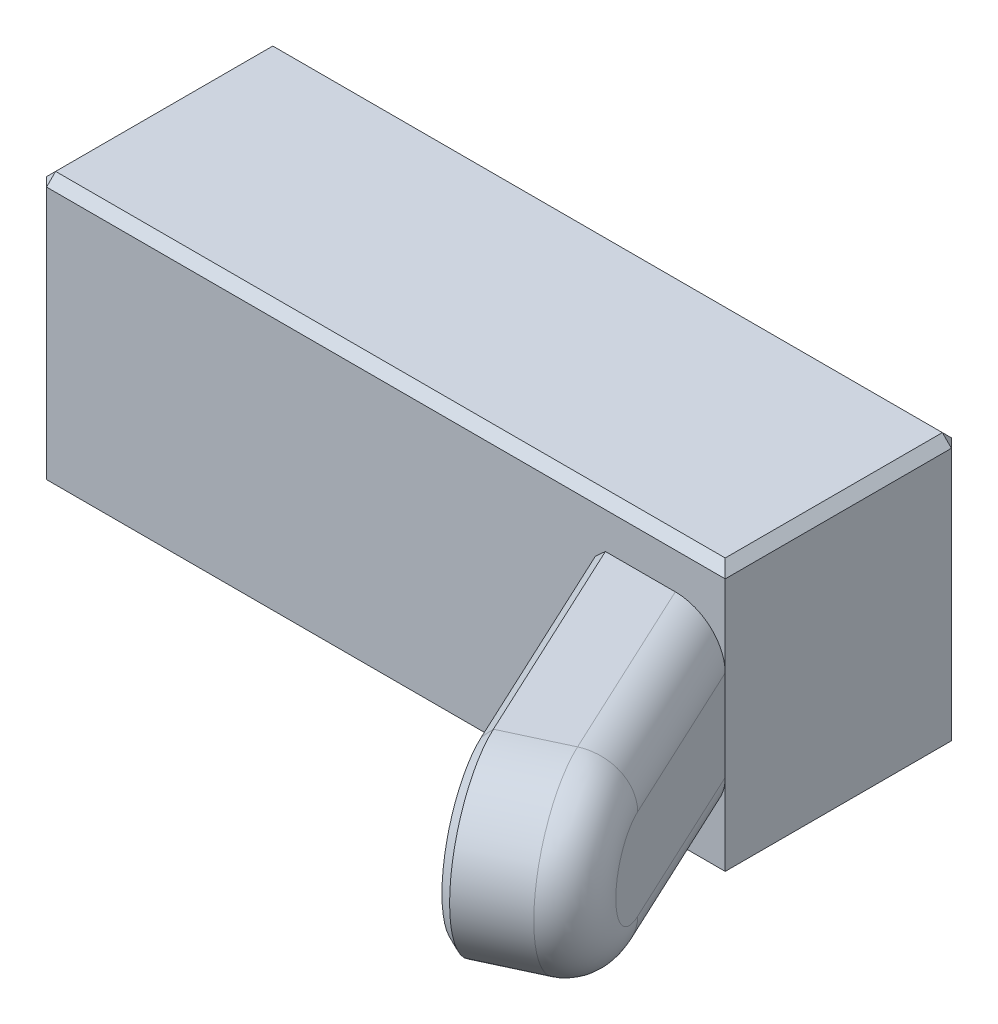
ISO-10303-21;
HEADER;
FILE_DESCRIPTION(('STEP AP214'),'2;1');
FILE_NAME('part.step','',(''),(''),'','','');
FILE_SCHEMA(('AUTOMOTIVE_DESIGN { 1 0 10303 214 1 1 1 1 }'));
ENDSEC;
DATA;
#1=APPLICATION_CONTEXT('core data for automotive mechanical design processes');
#2=APPLICATION_PROTOCOL_DEFINITION('international standard','automotive_design',2000,#1);
#3=PRODUCT_CONTEXT('',#1,'mechanical');
#4=PRODUCT('Part','Part','',(#3));
#5=PRODUCT_RELATED_PRODUCT_CATEGORY('part','',(#4));
#6=PRODUCT_DEFINITION_FORMATION('','',#4);
#7=PRODUCT_DEFINITION_CONTEXT('part definition',#1,'design');
#8=PRODUCT_DEFINITION('design','',#6,#7);
#9=PRODUCT_DEFINITION_SHAPE('','',#8);
#10=(LENGTH_UNIT() NAMED_UNIT(*) SI_UNIT(.MILLI.,.METRE.));
#11=(NAMED_UNIT(*) PLANE_ANGLE_UNIT() SI_UNIT($,.RADIAN.));
#12=(NAMED_UNIT(*) SI_UNIT($,.STERADIAN.) SOLID_ANGLE_UNIT());
#13=UNCERTAINTY_MEASURE_WITH_UNIT(LENGTH_MEASURE(1.E-05),#10,'distance_accuracy_value','');
#14=(GEOMETRIC_REPRESENTATION_CONTEXT(3) GLOBAL_UNCERTAINTY_ASSIGNED_CONTEXT((#13)) GLOBAL_UNIT_ASSIGNED_CONTEXT((#10,
#11,#12)) REPRESENTATION_CONTEXT('',''));
#15=CARTESIAN_POINT('',(0.,0.,0.));
#16=DIRECTION('',(0.,0.,1.));
#17=DIRECTION('',(1.,0.,0.));
#18=AXIS2_PLACEMENT_3D('',#15,#16,#17);
#19=CARTESIAN_POINT('',(-38.,-15.,13.));
#20=DIRECTION('',(-1.,0.,0.));
#21=DIRECTION('',(0.,0.,1.));
#22=AXIS2_PLACEMENT_3D('',#19,#20,#21);
#23=PLANE('',#22);
#24=DIRECTION('',(0.,-1.,0.));
#25=VECTOR('',#24,1.);
#26=CARTESIAN_POINT('',(-38.,-15.,-12.));
#27=LINE('',#26,#25);
#28=CARTESIAN_POINT('',(-38.,14.,-12.));
#29=VERTEX_POINT('',#28);
#30=CARTESIAN_POINT('',(-38.,-14.,-12.));
#31=VERTEX_POINT('',#30);
#32=EDGE_CURVE('E248',#29,#31,#27,.T.);
#33=ORIENTED_EDGE('',*,*,#32,.T.);
#34=DIRECTION('',(0.,0.,1.));
#35=VECTOR('',#34,1.);
#36=CARTESIAN_POINT('',(-38.,-14.,13.));
#37=LINE('',#36,#35);
#38=CARTESIAN_POINT('',(-38.,-14.,12.));
#39=VERTEX_POINT('',#38);
#40=EDGE_CURVE('E251',#31,#39,#37,.T.);
#41=ORIENTED_EDGE('',*,*,#40,.T.);
#42=DIRECTION('',(0.,1.,0.));
#43=VECTOR('',#42,1.);
#44=CARTESIAN_POINT('',(-38.,-15.,12.));
#45=LINE('',#44,#43);
#46=CARTESIAN_POINT('',(-38.,14.,12.));
#47=VERTEX_POINT('',#46);
#48=EDGE_CURVE('E246',#39,#47,#45,.T.);
#49=ORIENTED_EDGE('',*,*,#48,.T.);
#50=DIRECTION('',(0.,0.,-1.));
#51=VECTOR('',#50,1.);
#52=CARTESIAN_POINT('',(-38.,14.,13.));
#53=LINE('',#52,#51);
#54=EDGE_CURVE('E244',#47,#29,#53,.T.);
#55=ORIENTED_EDGE('',*,*,#54,.T.);
#56=EDGE_LOOP('',(#33,#41,#49,#55));
#57=FACE_BOUND('',#56,.T.);
#58=ADVANCED_FACE('F35',(#57),#23,.T.);
#59=CARTESIAN_POINT('',(38.,-15.,-13.));
#60=DIRECTION('',(0.,0.,-1.));
#61=DIRECTION('',(-1.,0.,0.));
#62=AXIS2_PLACEMENT_3D('',#59,#60,#61);
#63=PLANE('',#62);
#64=DIRECTION('',(-1.,0.,0.));
#65=VECTOR('',#64,1.);
#66=CARTESIAN_POINT('',(-38.,-14.,-13.));
#67=LINE('',#66,#65);
#68=CARTESIAN_POINT('',(37.,-14.,-13.));
#69=VERTEX_POINT('',#68);
#70=CARTESIAN_POINT('',(-37.,-14.,-13.));
#71=VERTEX_POINT('',#70);
#72=EDGE_CURVE('E239',#69,#71,#67,.T.);
#73=ORIENTED_EDGE('',*,*,#72,.T.);
#74=DIRECTION('',(0.,1.,0.));
#75=VECTOR('',#74,1.);
#76=CARTESIAN_POINT('',(-37.,-15.,-13.));
#77=LINE('',#76,#75);
#78=CARTESIAN_POINT('',(-37.,14.,-13.));
#79=VERTEX_POINT('',#78);
#80=EDGE_CURVE('E241',#71,#79,#77,.T.);
#81=ORIENTED_EDGE('',*,*,#80,.T.);
#82=DIRECTION('',(1.,0.,0.));
#83=VECTOR('',#82,1.);
#84=CARTESIAN_POINT('',(38.,14.,-13.));
#85=LINE('',#84,#83);
#86=CARTESIAN_POINT('',(37.,14.,-13.));
#87=VERTEX_POINT('',#86);
#88=EDGE_CURVE('E237',#79,#87,#85,.T.);
#89=ORIENTED_EDGE('',*,*,#88,.T.);
#90=DIRECTION('',(0.,-1.,0.));
#91=VECTOR('',#90,1.);
#92=CARTESIAN_POINT('',(37.,-15.,-13.));
#93=LINE('',#92,#91);
#94=EDGE_CURVE('E235',#87,#69,#93,.T.);
#95=ORIENTED_EDGE('',*,*,#94,.T.);
#96=EDGE_LOOP('',(#73,#81,#89,#95));
#97=FACE_BOUND('',#96,.T.);
#98=ADVANCED_FACE('F372',(#97),#63,.T.);
#99=CARTESIAN_POINT('',(38.,-15.,13.));
#100=DIRECTION('',(1.,0.,0.));
#101=DIRECTION('',(0.,0.,-1.));
#102=AXIS2_PLACEMENT_3D('',#99,#100,#101);
#103=PLANE('',#102);
#104=DIRECTION('',(0.,1.,0.));
#105=VECTOR('',#104,1.);
#106=CARTESIAN_POINT('',(38.,-15.,13.));
#107=LINE('',#106,#105);
#108=CARTESIAN_POINT('',(38.,-14.,13.));
#109=VERTEX_POINT('',#108);
#110=CARTESIAN_POINT('',(38.,-5.,13.));
#111=VERTEX_POINT('',#110);
#112=EDGE_CURVE('E188',#109,#111,#107,.T.);
#113=ORIENTED_EDGE('',*,*,#112,.F.);
#114=DIRECTION('',(0.,0.,-1.));
#115=VECTOR('',#114,1.);
#116=CARTESIAN_POINT('',(38.,-14.,-13.));
#117=LINE('',#116,#115);
#118=CARTESIAN_POINT('',(38.,-14.,-12.));
#119=VERTEX_POINT('',#118);
#120=EDGE_CURVE('E272',#109,#119,#117,.T.);
#121=ORIENTED_EDGE('',*,*,#120,.T.);
#122=DIRECTION('',(0.,1.,0.));
#123=VECTOR('',#122,1.);
#124=CARTESIAN_POINT('',(38.,-15.,-12.));
#125=LINE('',#124,#123);
#126=CARTESIAN_POINT('',(38.,14.,-12.));
#127=VERTEX_POINT('',#126);
#128=EDGE_CURVE('E268',#119,#127,#125,.T.);
#129=ORIENTED_EDGE('',*,*,#128,.T.);
#130=DIRECTION('',(0.,0.,1.));
#131=VECTOR('',#130,1.);
#132=CARTESIAN_POINT('',(38.,14.,13.));
#133=LINE('',#132,#131);
#134=CARTESIAN_POINT('',(38.,14.,13.));
#135=VERTEX_POINT('',#134);
#136=EDGE_CURVE('E270',#127,#135,#133,.T.);
#137=ORIENTED_EDGE('',*,*,#136,.T.);
#138=CARTESIAN_POINT('',(38.,5.,13.));
#139=VERTEX_POINT('',#138);
#140=EDGE_CURVE('E204',#139,#135,#107,.T.);
#141=ORIENTED_EDGE('',*,*,#140,.F.);
#142=DIRECTION('',(0.,-1.,0.));
#143=VECTOR('',#142,1.);
#144=CARTESIAN_POINT('',(38.,10.,13.));
#145=LINE('',#144,#143);
#146=EDGE_CURVE('E648',#139,#111,#145,.T.);
#147=ORIENTED_EDGE('',*,*,#146,.T.);
#148=EDGE_LOOP('',(#113,#121,#129,#137,#141,#147));
#149=FACE_BOUND('',#148,.T.);
#150=ADVANCED_FACE('F404',(#149),#103,.T.);
#151=CARTESIAN_POINT('',(38.,-15.,13.));
#152=DIRECTION('',(0.,0.,1.));
#153=DIRECTION('',(1.,0.,0.));
#154=AXIS2_PLACEMENT_3D('',#151,#152,#153);
#155=PLANE('',#154);
#156=DIRECTION('',(0.,-1.,0.));
#157=VECTOR('',#156,1.);
#158=CARTESIAN_POINT('',(-37.,-15.,13.));
#159=LINE('',#158,#157);
#160=CARTESIAN_POINT('',(-37.,14.,13.));
#161=VERTEX_POINT('',#160);
#162=CARTESIAN_POINT('',(-37.,-14.,13.));
#163=VERTEX_POINT('',#162);
#164=EDGE_CURVE('E255',#161,#163,#159,.T.);
#165=ORIENTED_EDGE('',*,*,#164,.T.);
#166=DIRECTION('',(1.,0.,0.));
#167=VECTOR('',#166,1.);
#168=CARTESIAN_POINT('',(38.,-14.,13.));
#169=LINE('',#168,#167);
#170=EDGE_CURVE('E257',#163,#109,#169,.T.);
#171=ORIENTED_EDGE('',*,*,#170,.T.);
#172=ORIENTED_EDGE('',*,*,#112,.T.);
#173=CARTESIAN_POINT('',(32.4831104051875,-5.,13.));
#174=DIRECTION('',(0.,0.,1.));
#175=DIRECTION('',(1.,0.,0.));
#176=AXIS2_PLACEMENT_3D('',#173,#174,#175);
#177=ELLIPSE('',#176,5.51688959481248,5.);
#178=CARTESIAN_POINT('',(32.4831104051875,-10.,13.));
#179=VERTEX_POINT('',#178);
#180=EDGE_CURVE('E184',#111,#179,#177,.F.);
#181=ORIENTED_EDGE('',*,*,#180,.T.);
#182=DIRECTION('',(1.,0.,0.));
#183=VECTOR('',#182,1.);
#184=CARTESIAN_POINT('',(14.4665061710177,-10.,13.));
#185=LINE('',#184,#183);
#186=CARTESIAN_POINT('',(24.75946497245,-10.,13.));
#187=VERTEX_POINT('',#186);
#188=EDGE_CURVE('E170',#187,#179,#185,.T.);
#189=ORIENTED_EDGE('',*,*,#188,.F.);
#190=DIRECTION('',(0.740965645273289,-0.671542934237819,0.));
#191=VECTOR('',#190,1.);
#192=CARTESIAN_POINT('',(12.142057490973,1.43525465267711,13.));
#193=LINE('',#192,#191);
#194=CARTESIAN_POINT('',(23.6560870534876,-9.00000000000001,13.));
#195=VERTEX_POINT('',#194);
#196=EDGE_CURVE('E281',#187,#195,#193,.F.);
#197=ORIENTED_EDGE('',*,*,#196,.T.);
#198=DIRECTION('',(0.,-1.,0.));
#199=VECTOR('',#198,1.);
#200=CARTESIAN_POINT('',(23.6560870534876,-10.,13.));
#201=LINE('',#200,#199);
#202=CARTESIAN_POINT('',(23.6560870534876,9.00000000000002,13.));
#203=VERTEX_POINT('',#202);
#204=EDGE_CURVE('E180',#203,#195,#201,.T.);
#205=ORIENTED_EDGE('',*,*,#204,.F.);
#206=DIRECTION('',(-0.740965645273287,-0.671542934237821,0.));
#207=VECTOR('',#206,1.);
#208=CARTESIAN_POINT('',(13.1372379781656,-0.533314827627652,13.));
#209=LINE('',#208,#207);
#210=CARTESIAN_POINT('',(24.75946497245,10.,13.));
#211=VERTEX_POINT('',#210);
#212=EDGE_CURVE('E44',#203,#211,#209,.F.);
#213=ORIENTED_EDGE('',*,*,#212,.T.);
#214=DIRECTION('',(-1.,0.,0.));
#215=VECTOR('',#214,1.);
#216=CARTESIAN_POINT('',(2.68450493954131,10.,13.));
#217=LINE('',#216,#215);
#218=CARTESIAN_POINT('',(32.4831104051875,10.,13.));
#219=VERTEX_POINT('',#218);
#220=EDGE_CURVE('E181',#219,#211,#217,.T.);
#221=ORIENTED_EDGE('',*,*,#220,.F.);
#222=CARTESIAN_POINT('',(32.4831104051875,5.,13.));
#223=DIRECTION('',(0.,0.,1.));
#224=DIRECTION('',(-1.,0.,0.));
#225=AXIS2_PLACEMENT_3D('',#222,#223,#224);
#226=ELLIPSE('',#225,5.51688959481248,5.);
#227=EDGE_CURVE('E192',#219,#139,#226,.F.);
#228=ORIENTED_EDGE('',*,*,#227,.T.);
#229=ORIENTED_EDGE('',*,*,#140,.T.);
#230=DIRECTION('',(-1.,0.,0.));
#231=VECTOR('',#230,1.);
#232=CARTESIAN_POINT('',(38.,14.,13.));
#233=LINE('',#232,#231);
#234=EDGE_CURVE('E253',#135,#161,#233,.T.);
#235=ORIENTED_EDGE('',*,*,#234,.T.);
#236=EDGE_LOOP('',(#165,#171,#172,#181,#189,#197,#205,#213,#221,#228,#229,#235));
#237=FACE_BOUND('',#236,.T.);
#238=ADVANCED_FACE('F186',(#237),#155,.T.);
#239=CARTESIAN_POINT('',(0.,-15.,0.));
#240=DIRECTION('',(0.,1.,0.));
#241=DIRECTION('',(0.,0.,1.));
#242=AXIS2_PLACEMENT_3D('',#239,#240,#241);
#243=PLANE('',#242);
#244=CARTESIAN_POINT('',(-28.,-15.,0.));
#245=DIRECTION('',(0.,1.,0.));
#246=DIRECTION('',(0.,0.,1.));
#247=AXIS2_PLACEMENT_3D('',#244,#245,#246);
#248=CIRCLE('',#247,5.);
#249=CARTESIAN_POINT('',(-28.,-15.,5.));
#250=VERTEX_POINT('',#249);
#251=EDGE_CURVE('E11',#250,#250,#248,.F.);
#252=ORIENTED_EDGE('',*,*,#251,.F.);
#253=EDGE_LOOP('',(#252));
#254=FACE_BOUND('',#253,.T.);
#255=DIRECTION('',(0.,0.,1.));
#256=VECTOR('',#255,1.);
#257=CARTESIAN_POINT('',(37.,-15.,13.));
#258=LINE('',#257,#256);
#259=CARTESIAN_POINT('',(37.,-15.,-12.));
#260=VERTEX_POINT('',#259);
#261=CARTESIAN_POINT('',(37.,-15.,12.));
#262=VERTEX_POINT('',#261);
#263=EDGE_CURVE('E263',#260,#262,#258,.T.);
#264=ORIENTED_EDGE('',*,*,#263,.T.);
#265=DIRECTION('',(-1.,0.,0.));
#266=VECTOR('',#265,1.);
#267=CARTESIAN_POINT('',(-38.,-15.,12.));
#268=LINE('',#267,#266);
#269=CARTESIAN_POINT('',(-37.,-15.,12.));
#270=VERTEX_POINT('',#269);
#271=EDGE_CURVE('E265',#262,#270,#268,.T.);
#272=ORIENTED_EDGE('',*,*,#271,.T.);
#273=DIRECTION('',(0.,0.,-1.));
#274=VECTOR('',#273,1.);
#275=CARTESIAN_POINT('',(-37.,-15.,-13.));
#276=LINE('',#275,#274);
#277=CARTESIAN_POINT('',(-37.,-15.,-12.));
#278=VERTEX_POINT('',#277);
#279=EDGE_CURVE('E261',#270,#278,#276,.T.);
#280=ORIENTED_EDGE('',*,*,#279,.T.);
#281=DIRECTION('',(1.,0.,0.));
#282=VECTOR('',#281,1.);
#283=CARTESIAN_POINT('',(38.,-15.,-12.));
#284=LINE('',#283,#282);
#285=EDGE_CURVE('E259',#278,#260,#284,.T.);
#286=ORIENTED_EDGE('',*,*,#285,.T.);
#287=EDGE_LOOP('',(#264,#272,#280,#286));
#288=FACE_BOUND('',#287,.T.);
#289=ADVANCED_FACE('F352',(#254,#288),#243,.F.);
#290=CARTESIAN_POINT('',(0.,15.,0.));
#291=DIRECTION('',(0.,1.,0.));
#292=DIRECTION('',(0.,0.,1.));
#293=AXIS2_PLACEMENT_3D('',#290,#291,#292);
#294=PLANE('',#293);
#295=DIRECTION('',(0.,0.,-1.));
#296=VECTOR('',#295,1.);
#297=CARTESIAN_POINT('',(37.,15.,0.));
#298=LINE('',#297,#296);
#299=CARTESIAN_POINT('',(37.,15.,12.));
#300=VERTEX_POINT('',#299);
#301=CARTESIAN_POINT('',(37.,15.,-12.));
#302=VERTEX_POINT('',#301);
#303=EDGE_CURVE('E274',#300,#302,#298,.T.);
#304=ORIENTED_EDGE('',*,*,#303,.T.);
#305=DIRECTION('',(-1.,0.,0.));
#306=VECTOR('',#305,1.);
#307=CARTESIAN_POINT('',(0.,15.,-12.));
#308=LINE('',#307,#306);
#309=CARTESIAN_POINT('',(-37.,15.,-12.));
#310=VERTEX_POINT('',#309);
#311=EDGE_CURVE('E279',#302,#310,#308,.T.);
#312=ORIENTED_EDGE('',*,*,#311,.T.);
#313=DIRECTION('',(0.,0.,1.));
#314=VECTOR('',#313,1.);
#315=CARTESIAN_POINT('',(-37.,15.,0.));
#316=LINE('',#315,#314);
#317=CARTESIAN_POINT('',(-37.,15.,12.));
#318=VERTEX_POINT('',#317);
#319=EDGE_CURVE('E59',#310,#318,#316,.T.);
#320=ORIENTED_EDGE('',*,*,#319,.T.);
#321=DIRECTION('',(1.,0.,0.));
#322=VECTOR('',#321,1.);
#323=CARTESIAN_POINT('',(0.,15.,12.));
#324=LINE('',#323,#322);
#325=EDGE_CURVE('E276',#318,#300,#324,.T.);
#326=ORIENTED_EDGE('',*,*,#325,.T.);
#327=EDGE_LOOP('',(#304,#312,#320,#326));
#328=FACE_BOUND('',#327,.T.);
#329=ADVANCED_FACE('F573',(#328),#294,.T.);
#330=CARTESIAN_POINT('',(14.4665061710177,-10.,-37.4677403800205));
#331=DIRECTION('',(0.,1.,0.));
#332=DIRECTION('',(0.,0.,1.));
#333=AXIS2_PLACEMENT_3D('',#330,#331,#332);
#334=PLANE('',#333);
#335=DIRECTION('',(0.906307787036647,0.,-0.422618261740706));
#336=VECTOR('',#335,1.);
#337=CARTESIAN_POINT('',(34.6703640033377,-10.,36.6201931433621));
#338=LINE('',#337,#336);
#339=CARTESIAN_POINT('',(35.5766717903744,-10.,36.1975748816214));
#340=VERTEX_POINT('',#339);
#341=CARTESIAN_POINT('',(41.9208262996309,-10.,33.2392470494365));
#342=VERTEX_POINT('',#341);
#343=EDGE_CURVE('E646',#340,#342,#338,.T.);
#344=ORIENTED_EDGE('',*,*,#343,.F.);
#345=DIRECTION('',(-0.422618261740707,0.,-0.906307787036647));
#346=VECTOR('',#345,1.);
#347=CARTESIAN_POINT('',(3.59081272657794,-10.,-32.396321239132));
#348=LINE('',#347,#346);
#349=EDGE_CURVE('E177',#340,#187,#348,.T.);
#350=ORIENTED_EDGE('',*,*,#349,.T.);
#351=ORIENTED_EDGE('',*,*,#188,.T.);
#352=DIRECTION('',(0.422618261740706,0.,0.906307787036647));
#353=VECTOR('',#352,1.);
#354=CARTESIAN_POINT('',(9.93496723583448,-10.,-35.354649071317));
#355=LINE('',#354,#353);
#356=EDGE_CURVE('E175',#179,#342,#355,.T.);
#357=ORIENTED_EDGE('',*,*,#356,.T.);
#358=EDGE_LOOP('',(#344,#350,#351,#357));
#359=FACE_BOUND('',#358,.T.);
#360=ADVANCED_FACE('F173',(#359),#334,.F.);
#361=CARTESIAN_POINT('',(2.6845049395413,-10.,-31.9737029773913));
#362=DIRECTION('',(0.906307787036647,0.,-0.422618261740706));
#363=DIRECTION('',(-0.422618261740706,0.,-0.906307787036647));
#364=AXIS2_PLACEMENT_3D('',#361,#362,#363);
#365=PLANE('',#364);
#366=ORIENTED_EDGE('',*,*,#204,.T.);
#367=DIRECTION('',(0.422618261740706,0.,0.906307787036647));
#368=VECTOR('',#367,1.);
#369=CARTESIAN_POINT('',(2.6845049395413,-9.00000000000001,-31.9737029773913));
#370=LINE('',#369,#368);
#371=CARTESIAN_POINT('',(34.6703640033377,-9.00000000000001,36.6201931433621));
#372=VERTEX_POINT('',#371);
#373=EDGE_CURVE('E227',#195,#372,#370,.T.);
#374=ORIENTED_EDGE('',*,*,#373,.T.);
#375=CARTESIAN_POINT('',(34.6703640033377,0.,36.6201931433621));
#376=DIRECTION('',(0.906307787036647,0.,-0.422618261740706));
#377=DIRECTION('',(-0.422618261740706,0.,-0.906307787036647));
#378=AXIS2_PLACEMENT_3D('',#375,#376,#377);
#379=CIRCLE('',#378,9.00000000000001);
#380=CARTESIAN_POINT('',(34.6703640033377,9.00000000000002,36.6201931433621));
#381=VERTEX_POINT('',#380);
#382=EDGE_CURVE('E225',#372,#381,#379,.F.);
#383=ORIENTED_EDGE('',*,*,#382,.T.);
#384=DIRECTION('',(-0.422618261740706,0.,-0.906307787036647));
#385=VECTOR('',#384,1.);
#386=CARTESIAN_POINT('',(2.6845049395413,9.00000000000002,-31.9737029773913));
#387=LINE('',#386,#385);
#388=EDGE_CURVE('E217',#381,#203,#387,.T.);
#389=ORIENTED_EDGE('',*,*,#388,.T.);
#390=EDGE_LOOP('',(#366,#374,#383,#389));
#391=FACE_BOUND('',#390,.T.);
#392=ADVANCED_FACE('F570',(#391),#365,.F.);
#393=CARTESIAN_POINT('',(2.6845049395413,10.,-31.9737029773913));
#394=DIRECTION('',(0.,-1.,0.));
#395=DIRECTION('',(0.,0.,-1.));
#396=AXIS2_PLACEMENT_3D('',#393,#394,#395);
#397=PLANE('',#396);
#398=ORIENTED_EDGE('',*,*,#220,.T.);
#399=DIRECTION('',(0.422618261740707,0.,0.906307787036647));
#400=VECTOR('',#399,1.);
#401=CARTESIAN_POINT('',(3.59081272657793,10.,-32.396321239132));
#402=LINE('',#401,#400);
#403=CARTESIAN_POINT('',(35.5766717903744,10.,36.1975748816214));
#404=VERTEX_POINT('',#403);
#405=EDGE_CURVE('E233',#211,#404,#402,.T.);
#406=ORIENTED_EDGE('',*,*,#405,.T.);
#407=DIRECTION('',(0.906307787036647,0.,-0.422618261740706));
#408=VECTOR('',#407,1.);
#409=CARTESIAN_POINT('',(34.6703640033377,10.,36.6201931433621));
#410=LINE('',#409,#408);
#411=CARTESIAN_POINT('',(41.9208262996309,10.,33.2392470494365));
#412=VERTEX_POINT('',#411);
#413=EDGE_CURVE('E223',#404,#412,#410,.T.);
#414=ORIENTED_EDGE('',*,*,#413,.T.);
#415=DIRECTION('',(-0.422618261740706,0.,-0.906307787036647));
#416=VECTOR('',#415,1.);
#417=CARTESIAN_POINT('',(9.93496723583449,10.,-35.354649071317));
#418=LINE('',#417,#416);
#419=EDGE_CURVE('E211',#412,#219,#418,.T.);
#420=ORIENTED_EDGE('',*,*,#419,.T.);
#421=EDGE_LOOP('',(#398,#406,#414,#420));
#422=FACE_BOUND('',#421,.T.);
#423=ADVANCED_FACE('F562',(#422),#397,.F.);
#424=CARTESIAN_POINT('',(34.6703640033377,0.,36.6201931433621));
#425=DIRECTION('',(0.906307787036647,0.,-0.422618261740706));
#426=DIRECTION('',(-0.422618261740706,0.,-0.906307787036647));
#427=AXIS2_PLACEMENT_3D('',#424,#425,#426);
#428=CYLINDRICAL_SURFACE('',#427,10.);
#429=ORIENTED_EDGE('',*,*,#413,.F.);
#430=CARTESIAN_POINT('',(35.5766717903744,0.,36.1975748816214));
#431=DIRECTION('',(0.906307787036646,0.,-0.422618261740708));
#432=DIRECTION('',(-0.422618261740708,0.,-0.906307787036646));
#433=AXIS2_PLACEMENT_3D('',#430,#431,#432);
#434=CIRCLE('',#433,10.);
#435=EDGE_CURVE('E231',#404,#340,#434,.T.);
#436=ORIENTED_EDGE('',*,*,#435,.T.);
#437=ORIENTED_EDGE('',*,*,#343,.T.);
#438=CARTESIAN_POINT('',(41.9208262996309,0.,33.2392470494365));
#439=DIRECTION('',(-0.906307787036647,0.,0.422618261740706));
#440=DIRECTION('',(0.422618261740706,0.,0.906307787036647));
#441=AXIS2_PLACEMENT_3D('',#438,#439,#440);
#442=CIRCLE('',#441,10.);
#443=EDGE_CURVE('E193',#342,#412,#442,.T.);
#444=ORIENTED_EDGE('',*,*,#443,.T.);
#445=EDGE_LOOP('',(#429,#436,#437,#444));
#446=FACE_BOUND('',#445,.T.);
#447=ADVANCED_FACE('F555',(#446),#428,.T.);
#448=CARTESIAN_POINT('',(46.4523652348141,0.,31.1261557407329));
#449=DIRECTION('',(-0.906307787036647,0.,0.422618261740706));
#450=DIRECTION('',(0.422618261740706,0.,0.906307787036647));
#451=AXIS2_PLACEMENT_3D('',#448,#449,#450);
#452=PLANE('',#451);
#453=CARTESIAN_POINT('',(46.4523652348141,0.,31.1261557407329));
#454=DIRECTION('',(-0.906307787036647,0.,0.422618261740706));
#455=DIRECTION('',(0.422618261740706,0.,0.906307787036647));
#456=AXIS2_PLACEMENT_3D('',#453,#454,#455);
#457=CIRCLE('',#456,5.);
#458=CARTESIAN_POINT('',(46.4523652348141,5.,31.1261557407329));
#459=VERTEX_POINT('',#458);
#460=CARTESIAN_POINT('',(46.4523652348141,-5.,31.1261557407329));
#461=VERTEX_POINT('',#460);
#462=EDGE_CURVE('E200',#459,#461,#457,.F.);
#463=ORIENTED_EDGE('',*,*,#462,.T.);
#464=DIRECTION('',(0.422618261740706,0.,0.906307787036647));
#465=VECTOR('',#464,1.);
#466=CARTESIAN_POINT('',(46.4523652348141,-5.,31.1261557407329));
#467=LINE('',#466,#465);
#468=EDGE_CURVE('E209',#461,#111,#467,.F.);
#469=ORIENTED_EDGE('',*,*,#468,.T.);
#470=ORIENTED_EDGE('',*,*,#146,.F.);
#471=DIRECTION('',(-0.422618261740706,0.,-0.906307787036647));
#472=VECTOR('',#471,1.);
#473=CARTESIAN_POINT('',(46.4523652348141,5.,31.1261557407329));
#474=LINE('',#473,#472);
#475=EDGE_CURVE('E202',#139,#459,#474,.F.);
#476=ORIENTED_EDGE('',*,*,#475,.T.);
#477=EDGE_LOOP('',(#463,#469,#470,#476));
#478=FACE_BOUND('',#477,.T.);
#479=ADVANCED_FACE('F419',(#478),#452,.F.);
#480=CARTESIAN_POINT('',(9.93496723583449,5.,-35.354649071317));
#481=DIRECTION('',(-0.422618261740706,0.,-0.906307787036647));
#482=DIRECTION('',(-0.906307787036647,0.,0.422618261740706));
#483=AXIS2_PLACEMENT_3D('',#480,#481,#482);
#484=CYLINDRICAL_SURFACE('',#483,5.);
#485=ORIENTED_EDGE('',*,*,#227,.F.);
#486=ORIENTED_EDGE('',*,*,#419,.F.);
#487=CARTESIAN_POINT('',(41.9208262996309,5.,33.2392470494365));
#488=DIRECTION('',(0.422618261740707,0.,0.906307787036647));
#489=DIRECTION('',(0.906307787036647,0.,-0.422618261740707));
#490=AXIS2_PLACEMENT_3D('',#487,#488,#489);
#491=CIRCLE('',#490,5.);
#492=EDGE_CURVE('E219',#459,#412,#491,.T.);
#493=ORIENTED_EDGE('',*,*,#492,.F.);
#494=ORIENTED_EDGE('',*,*,#475,.F.);
#495=EDGE_LOOP('',(#485,#486,#493,#494));
#496=FACE_BOUND('',#495,.T.);
#497=ADVANCED_FACE('F415',(#496),#484,.T.);
#498=CARTESIAN_POINT('',(41.9208262996309,0.,33.2392470494365));
#499=DIRECTION('',(-0.906307787036647,0.,0.422618261740706));
#500=DIRECTION('',(0.422618261740706,0.,0.906307787036647));
#501=AXIS2_PLACEMENT_3D('',#498,#499,#500);
#502=DEGENERATE_TOROIDAL_SURFACE('',#501,5.,5.,.T.);
#503=ORIENTED_EDGE('',*,*,#492,.T.);
#504=ORIENTED_EDGE('',*,*,#443,.F.);
#505=CARTESIAN_POINT('',(41.9208262996309,-5.,33.2392470494365));
#506=DIRECTION('',(-0.422618261740707,0.,-0.906307787036646));
#507=DIRECTION('',(-0.906307787036647,0.,0.422618261740707));
#508=AXIS2_PLACEMENT_3D('',#505,#506,#507);
#509=CIRCLE('',#508,5.);
#510=EDGE_CURVE('E198',#461,#342,#509,.T.);
#511=ORIENTED_EDGE('',*,*,#510,.F.);
#512=ORIENTED_EDGE('',*,*,#462,.F.);
#513=EDGE_LOOP('',(#503,#504,#511,#512));
#514=FACE_BOUND('',#513,.T.);
#515=ADVANCED_FACE('F412',(#514),#502,.T.);
#516=CARTESIAN_POINT('',(9.93496723583449,-5.,-35.354649071317));
#517=DIRECTION('',(0.422618261740706,0.,0.906307787036647));
#518=DIRECTION('',(0.906307787036647,0.,-0.422618261740706));
#519=AXIS2_PLACEMENT_3D('',#516,#517,#518);
#520=CYLINDRICAL_SURFACE('',#519,5.);
#521=ORIENTED_EDGE('',*,*,#180,.F.);
#522=ORIENTED_EDGE('',*,*,#468,.F.);
#523=ORIENTED_EDGE('',*,*,#510,.T.);
#524=ORIENTED_EDGE('',*,*,#356,.F.);
#525=EDGE_LOOP('',(#521,#522,#523,#524));
#526=FACE_BOUND('',#525,.T.);
#527=ADVANCED_FACE('F196',(#526),#520,.T.);
#528=CARTESIAN_POINT('',(3.59081272657793,10.,-32.396321239132));
#529=DIRECTION('',(0.64085638205579,-0.707106781186543,-0.298836238730126));
#530=DIRECTION('',(0.422618261740706,0.,0.906307787036647));
#531=AXIS2_PLACEMENT_3D('',#528,#529,#530);
#532=PLANE('',#531);
#533=ORIENTED_EDGE('',*,*,#212,.F.);
#534=ORIENTED_EDGE('',*,*,#388,.F.);
#535=DIRECTION('',(-0.640856382055785,-0.707106781186548,0.298836238730125));
#536=VECTOR('',#535,1.);
#537=CARTESIAN_POINT('',(35.5766717903744,10.,36.1975748816214));
#538=LINE('',#537,#536);
#539=EDGE_CURVE('E220',#404,#381,#538,.T.);
#540=ORIENTED_EDGE('',*,*,#539,.F.);
#541=ORIENTED_EDGE('',*,*,#405,.F.);
#542=EDGE_LOOP('',(#533,#534,#540,#541));
#543=FACE_BOUND('',#542,.T.);
#544=ADVANCED_FACE('F411',(#543),#532,.F.);
#545=CARTESIAN_POINT('',(34.6703640033377,0.,36.6201931433621));
#546=DIRECTION('',(0.906307787036646,0.,-0.422618261740708));
#547=DIRECTION('',(-0.422618261740708,0.,-0.906307787036646));
#548=AXIS2_PLACEMENT_3D('',#545,#546,#547);
#549=CONICAL_SURFACE('',#548,9.00000000000001,0.785398163397453);
#550=ORIENTED_EDGE('',*,*,#539,.T.);
#551=ORIENTED_EDGE('',*,*,#382,.F.);
#552=DIRECTION('',(-0.640856382055786,0.707106781186549,0.298836238730123));
#553=VECTOR('',#552,1.);
#554=CARTESIAN_POINT('',(35.5766717903744,-10.,36.1975748816214));
#555=LINE('',#554,#553);
#556=EDGE_CURVE('E284',#340,#372,#555,.T.);
#557=ORIENTED_EDGE('',*,*,#556,.F.);
#558=ORIENTED_EDGE('',*,*,#435,.F.);
#559=EDGE_LOOP('',(#550,#551,#557,#558));
#560=FACE_BOUND('',#559,.T.);
#561=ADVANCED_FACE('F428',(#560),#549,.T.);
#562=CARTESIAN_POINT('',(2.6845049395413,-9.00000000000001,-31.9737029773913));
#563=DIRECTION('',(0.640856382055788,0.707106781186546,-0.298836238730126));
#564=DIRECTION('',(0.422618261740706,0.,0.906307787036647));
#565=AXIS2_PLACEMENT_3D('',#562,#563,#564);
#566=PLANE('',#565);
#567=ORIENTED_EDGE('',*,*,#196,.F.);
#568=ORIENTED_EDGE('',*,*,#349,.F.);
#569=ORIENTED_EDGE('',*,*,#556,.T.);
#570=ORIENTED_EDGE('',*,*,#373,.F.);
#571=EDGE_LOOP('',(#567,#568,#569,#570));
#572=FACE_BOUND('',#571,.T.);
#573=ADVANCED_FACE('F422',(#572),#566,.F.);
#574=CARTESIAN_POINT('',(38.,-14.,13.));
#575=DIRECTION('',(0.,-0.707106781186553,0.707106781186542));
#576=DIRECTION('',(-1.,0.,0.));
#577=AXIS2_PLACEMENT_3D('',#574,#575,#576);
#578=PLANE('',#577);
#579=DIRECTION('',(0.,0.707106781186542,0.707106781186553));
#580=VECTOR('',#579,1.);
#581=CARTESIAN_POINT('',(-37.,-14.,13.));
#582=LINE('',#581,#580);
#583=EDGE_CURVE('E333',#270,#163,#582,.T.);
#584=ORIENTED_EDGE('',*,*,#583,.F.);
#585=ORIENTED_EDGE('',*,*,#271,.F.);
#586=DIRECTION('',(-0.577350269189628,-0.57735026918962,-0.577350269189629));
#587=VECTOR('',#586,1.);
#588=CARTESIAN_POINT('',(38.,-14.,13.));
#589=LINE('',#588,#587);
#590=EDGE_CURVE('E286',#109,#262,#589,.T.);
#591=ORIENTED_EDGE('',*,*,#590,.F.);
#592=ORIENTED_EDGE('',*,*,#170,.F.);
#593=EDGE_LOOP('',(#584,#585,#591,#592));
#594=FACE_BOUND('',#593,.T.);
#595=ADVANCED_FACE('F38',(#594),#578,.T.);
#596=CARTESIAN_POINT('',(38.,-14.,13.));
#597=DIRECTION('',(0.707106781186542,-0.707106781186552,0.));
#598=DIRECTION('',(0.,0.,1.));
#599=AXIS2_PLACEMENT_3D('',#596,#597,#598);
#600=PLANE('',#599);
#601=ORIENTED_EDGE('',*,*,#590,.T.);
#602=ORIENTED_EDGE('',*,*,#263,.F.);
#603=DIRECTION('',(-0.707106781186552,-0.707106781186543,0.));
#604=VECTOR('',#603,1.);
#605=CARTESIAN_POINT('',(38.,-14.,-12.));
#606=LINE('',#605,#604);
#607=EDGE_CURVE('E330',#119,#260,#606,.T.);
#608=ORIENTED_EDGE('',*,*,#607,.F.);
#609=ORIENTED_EDGE('',*,*,#120,.F.);
#610=EDGE_LOOP('',(#601,#602,#608,#609));
#611=FACE_BOUND('',#610,.T.);
#612=ADVANCED_FACE('F345',(#611),#600,.T.);
#613=CARTESIAN_POINT('',(38.,-15.,-12.));
#614=DIRECTION('',(-0.707106781186542,0.,0.707106781186552));
#615=DIRECTION('',(0.,1.,0.));
#616=AXIS2_PLACEMENT_3D('',#613,#614,#615);
#617=PLANE('',#616);
#618=DIRECTION('',(0.707106781186552,0.,0.707106781186543));
#619=VECTOR('',#618,1.);
#620=CARTESIAN_POINT('',(37.,14.,-13.));
#621=LINE('',#620,#619);
#622=EDGE_CURVE('E324',#127,#87,#621,.F.);
#623=ORIENTED_EDGE('',*,*,#622,.F.);
#624=ORIENTED_EDGE('',*,*,#128,.F.);
#625=DIRECTION('',(-0.707106781186552,0.,-0.707106781186543));
#626=VECTOR('',#625,1.);
#627=CARTESIAN_POINT('',(38.,-14.,-12.));
#628=LINE('',#627,#626);
#629=EDGE_CURVE('E327',#69,#119,#628,.F.);
#630=ORIENTED_EDGE('',*,*,#629,.F.);
#631=ORIENTED_EDGE('',*,*,#94,.F.);
#632=EDGE_LOOP('',(#623,#624,#630,#631));
#633=FACE_BOUND('',#632,.T.);
#634=ADVANCED_FACE('F379',(#633),#617,.F.);
#635=CARTESIAN_POINT('',(37.,15.,0.));
#636=DIRECTION('',(-0.707106781186542,-0.707106781186552,0.));
#637=DIRECTION('',(0.,0.,-1.));
#638=AXIS2_PLACEMENT_3D('',#635,#636,#637);
#639=PLANE('',#638);
#640=DIRECTION('',(-0.707106781186552,0.707106781186543,0.));
#641=VECTOR('',#640,1.);
#642=CARTESIAN_POINT('',(37.5,14.5,-12.));
#643=LINE('',#642,#641);
#644=EDGE_CURVE('E321',#302,#127,#643,.F.);
#645=ORIENTED_EDGE('',*,*,#644,.F.);
#646=ORIENTED_EDGE('',*,*,#303,.F.);
#647=DIRECTION('',(0.577350269189634,-0.577350269189626,0.577350269189618));
#648=VECTOR('',#647,1.);
#649=CARTESIAN_POINT('',(33.,18.9999999999999,8.0000000000001));
#650=LINE('',#649,#648);
#651=EDGE_CURVE('E338',#135,#300,#650,.F.);
#652=ORIENTED_EDGE('',*,*,#651,.F.);
#653=ORIENTED_EDGE('',*,*,#136,.F.);
#654=EDGE_LOOP('',(#645,#646,#652,#653));
#655=FACE_BOUND('',#654,.T.);
#656=ADVANCED_FACE('F509',(#655),#639,.F.);
#657=CARTESIAN_POINT('',(0.,15.,12.));
#658=DIRECTION('',(0.,-0.707106781186543,-0.707106781186552));
#659=DIRECTION('',(1.,0.,0.));
#660=AXIS2_PLACEMENT_3D('',#657,#658,#659);
#661=PLANE('',#660);
#662=ORIENTED_EDGE('',*,*,#651,.T.);
#663=ORIENTED_EDGE('',*,*,#325,.F.);
#664=DIRECTION('',(0.,-0.707106781186552,0.707106781186543));
#665=VECTOR('',#664,1.);
#666=CARTESIAN_POINT('',(-37.,14.5,12.5));
#667=LINE('',#666,#665);
#668=EDGE_CURVE('E318',#161,#318,#667,.F.);
#669=ORIENTED_EDGE('',*,*,#668,.F.);
#670=ORIENTED_EDGE('',*,*,#234,.F.);
#671=EDGE_LOOP('',(#662,#663,#669,#670));
#672=FACE_BOUND('',#671,.T.);
#673=ADVANCED_FACE('F504',(#672),#661,.F.);
#674=CARTESIAN_POINT('',(-38.,-15.,12.));
#675=DIRECTION('',(0.707106781186542,0.,-0.707106781186552));
#676=DIRECTION('',(0.,1.,0.));
#677=AXIS2_PLACEMENT_3D('',#674,#675,#676);
#678=PLANE('',#677);
#679=DIRECTION('',(0.707106781186552,0.,0.707106781186543));
#680=VECTOR('',#679,1.);
#681=CARTESIAN_POINT('',(-37.,-14.,13.));
#682=LINE('',#681,#680);
#683=EDGE_CURVE('E335',#163,#39,#682,.F.);
#684=ORIENTED_EDGE('',*,*,#683,.F.);
#685=ORIENTED_EDGE('',*,*,#164,.F.);
#686=DIRECTION('',(-0.707106781186552,0.,-0.707106781186543));
#687=VECTOR('',#686,1.);
#688=CARTESIAN_POINT('',(-38.,14.,12.));
#689=LINE('',#688,#687);
#690=EDGE_CURVE('E315',#47,#161,#689,.F.);
#691=ORIENTED_EDGE('',*,*,#690,.F.);
#692=ORIENTED_EDGE('',*,*,#48,.F.);
#693=EDGE_LOOP('',(#684,#685,#691,#692));
#694=FACE_BOUND('',#693,.T.);
#695=ADVANCED_FACE('F393',(#694),#678,.F.);
#696=CARTESIAN_POINT('',(-37.,-14.,13.));
#697=DIRECTION('',(-0.577350269189618,-0.577350269189634,0.577350269189626));
#698=DIRECTION('',(0.,-0.707106781186543,-0.707106781186552));
#699=AXIS2_PLACEMENT_3D('',#696,#697,#698);
#700=PLANE('',#699);
#701=ORIENTED_EDGE('',*,*,#583,.T.);
#702=ORIENTED_EDGE('',*,*,#683,.T.);
#703=DIRECTION('',(0.707106781186552,-0.707106781186543,0.));
#704=VECTOR('',#703,1.);
#705=CARTESIAN_POINT('',(-37.5,-14.5,12.));
#706=LINE('',#705,#704);
#707=EDGE_CURVE('E312',#270,#39,#706,.F.);
#708=ORIENTED_EDGE('',*,*,#707,.F.);
#709=EDGE_LOOP('',(#701,#702,#708));
#710=FACE_BOUND('',#709,.T.);
#711=ADVANCED_FACE('F384',(#710),#700,.T.);
#712=CARTESIAN_POINT('',(38.,-14.,-12.));
#713=DIRECTION('',(0.577350269189618,-0.577350269189626,-0.577350269189634));
#714=DIRECTION('',(0.,0.707106781186552,-0.707106781186543));
#715=AXIS2_PLACEMENT_3D('',#712,#713,#714);
#716=PLANE('',#715);
#717=ORIENTED_EDGE('',*,*,#629,.T.);
#718=ORIENTED_EDGE('',*,*,#607,.T.);
#719=DIRECTION('',(0.,0.707106781186553,-0.707106781186542));
#720=VECTOR('',#719,1.);
#721=CARTESIAN_POINT('',(37.,-14.5,-12.5));
#722=LINE('',#721,#720);
#723=EDGE_CURVE('E309',#69,#260,#722,.F.);
#724=ORIENTED_EDGE('',*,*,#723,.F.);
#725=EDGE_LOOP('',(#717,#718,#724));
#726=FACE_BOUND('',#725,.T.);
#727=ADVANCED_FACE('F381',(#726),#716,.T.);
#728=CARTESIAN_POINT('',(37.,14.,-13.));
#729=DIRECTION('',(0.577350269189618,0.577350269189626,-0.577350269189634));
#730=DIRECTION('',(0.,0.707106781186552,0.707106781186543));
#731=AXIS2_PLACEMENT_3D('',#728,#729,#730);
#732=PLANE('',#731);
#733=ORIENTED_EDGE('',*,*,#644,.T.);
#734=ORIENTED_EDGE('',*,*,#622,.T.);
#735=DIRECTION('',(0.,-0.707106781186553,-0.707106781186542));
#736=VECTOR('',#735,1.);
#737=CARTESIAN_POINT('',(37.,14.,-13.));
#738=LINE('',#737,#736);
#739=EDGE_CURVE('E306',#302,#87,#738,.T.);
#740=ORIENTED_EDGE('',*,*,#739,.F.);
#741=EDGE_LOOP('',(#733,#734,#740));
#742=FACE_BOUND('',#741,.T.);
#743=ADVANCED_FACE('F383',(#742),#732,.T.);
#744=CARTESIAN_POINT('',(-38.,14.,12.));
#745=DIRECTION('',(-0.577350269189626,0.577350269189618,0.577350269189634));
#746=DIRECTION('',(0.707106781186552,0.,0.707106781186543));
#747=AXIS2_PLACEMENT_3D('',#744,#745,#746);
#748=PLANE('',#747);
#749=ORIENTED_EDGE('',*,*,#690,.T.);
#750=ORIENTED_EDGE('',*,*,#668,.T.);
#751=DIRECTION('',(0.707106781186543,0.707106781186552,0.));
#752=VECTOR('',#751,1.);
#753=CARTESIAN_POINT('',(-38.,14.,12.));
#754=LINE('',#753,#752);
#755=EDGE_CURVE('E303',#47,#318,#754,.T.);
#756=ORIENTED_EDGE('',*,*,#755,.F.);
#757=EDGE_LOOP('',(#749,#750,#756));
#758=FACE_BOUND('',#757,.T.);
#759=ADVANCED_FACE('F390',(#758),#748,.T.);
#760=CARTESIAN_POINT('',(-38.,-14.,13.));
#761=DIRECTION('',(-0.707106781186542,-0.707106781186552,0.));
#762=DIRECTION('',(0.,0.,-1.));
#763=AXIS2_PLACEMENT_3D('',#760,#761,#762);
#764=PLANE('',#763);
#765=ORIENTED_EDGE('',*,*,#707,.T.);
#766=ORIENTED_EDGE('',*,*,#40,.F.);
#767=DIRECTION('',(-0.707106781186552,0.707106781186543,0.));
#768=VECTOR('',#767,1.);
#769=CARTESIAN_POINT('',(-38.,-14.,-12.));
#770=LINE('',#769,#768);
#771=EDGE_CURVE('E300',#278,#31,#770,.T.);
#772=ORIENTED_EDGE('',*,*,#771,.F.);
#773=ORIENTED_EDGE('',*,*,#279,.F.);
#774=EDGE_LOOP('',(#765,#766,#772,#773));
#775=FACE_BOUND('',#774,.T.);
#776=ADVANCED_FACE('F363',(#775),#764,.T.);
#777=CARTESIAN_POINT('',(38.,-14.,-13.));
#778=DIRECTION('',(0.,-0.707106781186542,-0.707106781186553));
#779=DIRECTION('',(1.,0.,0.));
#780=AXIS2_PLACEMENT_3D('',#777,#778,#779);
#781=PLANE('',#780);
#782=ORIENTED_EDGE('',*,*,#723,.T.);
#783=ORIENTED_EDGE('',*,*,#285,.F.);
#784=DIRECTION('',(0.,-0.707106781186553,0.707106781186542));
#785=VECTOR('',#784,1.);
#786=CARTESIAN_POINT('',(-37.,-14.5,-12.5));
#787=LINE('',#786,#785);
#788=EDGE_CURVE('E297',#71,#278,#787,.T.);
#789=ORIENTED_EDGE('',*,*,#788,.F.);
#790=ORIENTED_EDGE('',*,*,#72,.F.);
#791=EDGE_LOOP('',(#782,#783,#789,#790));
#792=FACE_BOUND('',#791,.T.);
#793=ADVANCED_FACE('F357',(#792),#781,.T.);
#794=CARTESIAN_POINT('',(0.,15.,-12.));
#795=DIRECTION('',(0.,-0.707106781186542,0.707106781186553));
#796=DIRECTION('',(-1.,0.,0.));
#797=AXIS2_PLACEMENT_3D('',#794,#795,#796);
#798=PLANE('',#797);
#799=ORIENTED_EDGE('',*,*,#739,.T.);
#800=ORIENTED_EDGE('',*,*,#88,.F.);
#801=DIRECTION('',(0.,0.707106781186553,0.707106781186542));
#802=VECTOR('',#801,1.);
#803=CARTESIAN_POINT('',(-37.,14.,-13.));
#804=LINE('',#803,#802);
#805=EDGE_CURVE('E295',#310,#79,#804,.F.);
#806=ORIENTED_EDGE('',*,*,#805,.F.);
#807=ORIENTED_EDGE('',*,*,#311,.F.);
#808=EDGE_LOOP('',(#799,#800,#806,#807));
#809=FACE_BOUND('',#808,.T.);
#810=ADVANCED_FACE('F465',(#809),#798,.F.);
#811=CARTESIAN_POINT('',(-37.,15.,0.));
#812=DIRECTION('',(0.707106781186552,-0.707106781186542,0.));
#813=DIRECTION('',(0.,0.,1.));
#814=AXIS2_PLACEMENT_3D('',#811,#812,#813);
#815=PLANE('',#814);
#816=ORIENTED_EDGE('',*,*,#755,.T.);
#817=ORIENTED_EDGE('',*,*,#319,.F.);
#818=DIRECTION('',(-0.707106781186543,-0.707106781186552,0.));
#819=VECTOR('',#818,1.);
#820=CARTESIAN_POINT('',(-37.5,14.5,-12.));
#821=LINE('',#820,#819);
#822=EDGE_CURVE('E51',#29,#310,#821,.F.);
#823=ORIENTED_EDGE('',*,*,#822,.F.);
#824=ORIENTED_EDGE('',*,*,#54,.F.);
#825=EDGE_LOOP('',(#816,#817,#823,#824));
#826=FACE_BOUND('',#825,.T.);
#827=ADVANCED_FACE('F459',(#826),#815,.F.);
#828=CARTESIAN_POINT('',(-38.,-14.,-12.));
#829=DIRECTION('',(-0.577350269189618,-0.577350269189626,-0.577350269189634));
#830=DIRECTION('',(0.,0.707106781186552,-0.707106781186543));
#831=AXIS2_PLACEMENT_3D('',#828,#829,#830);
#832=PLANE('',#831);
#833=ORIENTED_EDGE('',*,*,#788,.T.);
#834=ORIENTED_EDGE('',*,*,#771,.T.);
#835=DIRECTION('',(-0.707106781186552,0.,0.707106781186543));
#836=VECTOR('',#835,1.);
#837=CARTESIAN_POINT('',(-38.,-14.,-12.));
#838=LINE('',#837,#836);
#839=EDGE_CURVE('E291',#71,#31,#838,.T.);
#840=ORIENTED_EDGE('',*,*,#839,.F.);
#841=EDGE_LOOP('',(#833,#834,#840));
#842=FACE_BOUND('',#841,.T.);
#843=ADVANCED_FACE('F366',(#842),#832,.T.);
#844=CARTESIAN_POINT('',(-37.,14.,-13.));
#845=DIRECTION('',(-0.577350269189626,0.577350269189618,-0.577350269189634));
#846=DIRECTION('',(-0.707106781186552,0.,0.707106781186543));
#847=AXIS2_PLACEMENT_3D('',#844,#845,#846);
#848=PLANE('',#847);
#849=ORIENTED_EDGE('',*,*,#822,.T.);
#850=ORIENTED_EDGE('',*,*,#805,.T.);
#851=DIRECTION('',(0.707106781186552,0.,-0.707106781186543));
#852=VECTOR('',#851,1.);
#853=CARTESIAN_POINT('',(-37.,14.,-13.));
#854=LINE('',#853,#852);
#855=EDGE_CURVE('E289',#29,#79,#854,.T.);
#856=ORIENTED_EDGE('',*,*,#855,.F.);
#857=EDGE_LOOP('',(#849,#850,#856));
#858=FACE_BOUND('',#857,.T.);
#859=ADVANCED_FACE('F448',(#858),#848,.T.);
#860=CARTESIAN_POINT('',(-37.,-15.,-13.));
#861=DIRECTION('',(0.707106781186542,0.,0.707106781186552));
#862=DIRECTION('',(0.,1.,0.));
#863=AXIS2_PLACEMENT_3D('',#860,#861,#862);
#864=PLANE('',#863);
#865=ORIENTED_EDGE('',*,*,#839,.T.);
#866=ORIENTED_EDGE('',*,*,#32,.F.);
#867=ORIENTED_EDGE('',*,*,#855,.T.);
#868=ORIENTED_EDGE('',*,*,#80,.F.);
#869=EDGE_LOOP('',(#865,#866,#867,#868));
#870=FACE_BOUND('',#869,.T.);
#871=ADVANCED_FACE('F370',(#870),#864,.F.);
#872=CARTESIAN_POINT('',(-28.,-17.,0.));
#873=DIRECTION('',(0.,1.,0.));
#874=DIRECTION('',(0.,0.,1.));
#875=AXIS2_PLACEMENT_3D('',#872,#873,#874);
#876=CYLINDRICAL_SURFACE('',#875,5.);
#877=CARTESIAN_POINT('',(-28.,-17.,0.));
#878=DIRECTION('',(0.,-1.,0.));
#879=DIRECTION('',(0.,0.,-1.));
#880=AXIS2_PLACEMENT_3D('',#877,#878,#879);
#881=CIRCLE('',#880,5.);
#882=CARTESIAN_POINT('',(-28.,-17.,-5.));
#883=VERTEX_POINT('',#882);
#884=EDGE_CURVE('E292',#883,#883,#881,.T.);
#885=ORIENTED_EDGE('',*,*,#884,.F.);
#886=EDGE_LOOP('',(#885));
#887=FACE_BOUND('',#886,.T.);
#888=ORIENTED_EDGE('',*,*,#251,.T.);
#889=EDGE_LOOP('',(#888));
#890=FACE_BOUND('',#889,.T.);
#891=ADVANCED_FACE('F447',(#887,#890),#876,.T.);
#892=CARTESIAN_POINT('',(-28.,-17.,0.));
#893=DIRECTION('',(0.,-1.,0.));
#894=DIRECTION('',(0.,0.,-1.));
#895=AXIS2_PLACEMENT_3D('',#892,#893,#894);
#896=PLANE('',#895);
#897=ORIENTED_EDGE('',*,*,#884,.T.);
#898=EDGE_LOOP('',(#897));
#899=FACE_BOUND('',#898,.T.);
#900=ADVANCED_FACE('F635',(#899),#896,.T.);
#901=CLOSED_SHELL('',(#58,#98,#150,#238,#289,#329,#360,#392,#423,#447,#479,#497,#515,#527,#544,
#561,#573,#595,#612,#634,#656,#673,#695,#711,#727,#743,#759,#776,#793,#810,#827,#843,#859,#871,
#891,#900));
#902=MANIFOLD_SOLID_BREP('B2',#901);
#903=ADVANCED_BREP_SHAPE_REPRESENTATION('',(#18,#902),#14);
#904=SHAPE_DEFINITION_REPRESENTATION(#9,#903);
ENDSEC;
END-ISO-10303-21;
